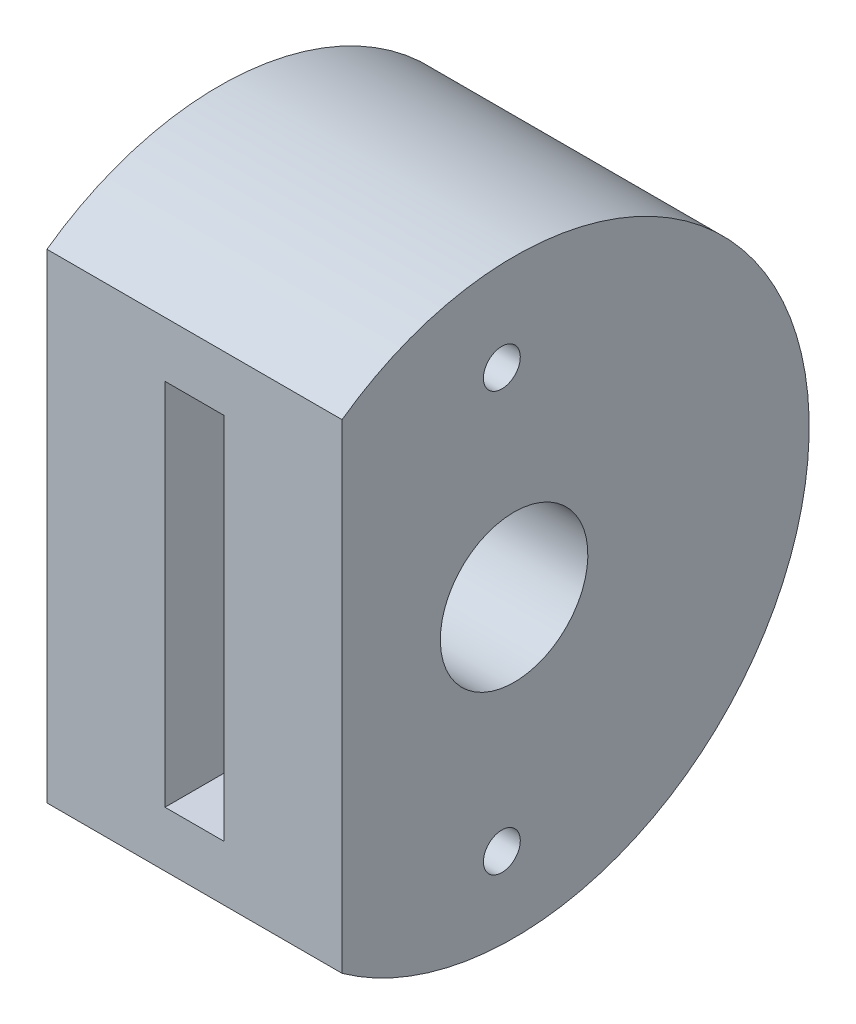
ISO-10303-21;
HEADER;
FILE_DESCRIPTION(('STEP AP214'),'2;1');
FILE_NAME('part.step','',(''),(''),'','','');
FILE_SCHEMA(('AUTOMOTIVE_DESIGN { 1 0 10303 214 1 1 1 1 }'));
ENDSEC;
DATA;
#1=APPLICATION_CONTEXT('core data for automotive mechanical design processes');
#2=APPLICATION_PROTOCOL_DEFINITION('international standard','automotive_design',2000,#1);
#3=PRODUCT_CONTEXT('',#1,'mechanical');
#4=PRODUCT('Part','Part','',(#3));
#5=PRODUCT_RELATED_PRODUCT_CATEGORY('part','',(#4));
#6=PRODUCT_DEFINITION_FORMATION('','',#4);
#7=PRODUCT_DEFINITION_CONTEXT('part definition',#1,'design');
#8=PRODUCT_DEFINITION('design','',#6,#7);
#9=PRODUCT_DEFINITION_SHAPE('','',#8);
#10=(LENGTH_UNIT() NAMED_UNIT(*) SI_UNIT(.MILLI.,.METRE.));
#11=(NAMED_UNIT(*) PLANE_ANGLE_UNIT() SI_UNIT($,.RADIAN.));
#12=(NAMED_UNIT(*) SI_UNIT($,.STERADIAN.) SOLID_ANGLE_UNIT());
#13=UNCERTAINTY_MEASURE_WITH_UNIT(LENGTH_MEASURE(1.E-05),#10,'distance_accuracy_value','');
#14=(GEOMETRIC_REPRESENTATION_CONTEXT(3) GLOBAL_UNCERTAINTY_ASSIGNED_CONTEXT((#13)) GLOBAL_UNIT_ASSIGNED_CONTEXT((#10,
#11,#12)) REPRESENTATION_CONTEXT('',''));
#15=CARTESIAN_POINT('',(0.,0.,0.));
#16=DIRECTION('',(0.,0.,1.));
#17=DIRECTION('',(1.,0.,0.));
#18=AXIS2_PLACEMENT_3D('',#15,#16,#17);
#19=CARTESIAN_POINT('',(-25.0457221896275,-2.04840081594534,4.83009691971683));
#20=DIRECTION('',(0.,0.,1.));
#21=DIRECTION('',(1.,0.,0.));
#22=AXIS2_PLACEMENT_3D('',#19,#20,#21);
#23=PLANE('',#22);
#24=DIRECTION('',(0.,1.,0.));
#25=VECTOR('',#24,1.);
#26=CARTESIAN_POINT('',(-13.0457221896275,-30.7984008159453,4.83009691971683));
#27=LINE('',#26,#25);
#28=CARTESIAN_POINT('',(-13.0457221896275,-28.0484008159453,4.83009691971683));
#29=VERTEX_POINT('',#28);
#30=CARTESIAN_POINT('',(-13.0457221896275,-8.54840081594534,4.83009691971683));
#31=VERTEX_POINT('',#30);
#32=EDGE_CURVE('E149',#29,#31,#27,.T.);
#33=ORIENTED_EDGE('',*,*,#32,.T.);
#34=DIRECTION('',(-1.,0.,0.));
#35=VECTOR('',#34,1.);
#36=CARTESIAN_POINT('',(-25.0457221896275,-8.54840081594534,4.83009691971683));
#37=LINE('',#36,#35);
#38=CARTESIAN_POINT('',(-17.0457221896275,-8.54840081594534,4.83009691971683));
#39=VERTEX_POINT('',#38);
#40=EDGE_CURVE('E137',#31,#39,#37,.T.);
#41=ORIENTED_EDGE('',*,*,#40,.T.);
#42=DIRECTION('',(0.,-1.,0.));
#43=VECTOR('',#42,1.);
#44=CARTESIAN_POINT('',(-17.0457221896275,-30.7984008159453,4.83009691971683));
#45=LINE('',#44,#43);
#46=CARTESIAN_POINT('',(-17.0457221896275,-28.0484008159453,4.83009691971683));
#47=VERTEX_POINT('',#46);
#48=EDGE_CURVE('E157',#39,#47,#45,.T.);
#49=ORIENTED_EDGE('',*,*,#48,.T.);
#50=DIRECTION('',(1.,0.,0.));
#51=VECTOR('',#50,1.);
#52=CARTESIAN_POINT('',(-25.0457221896275,-28.0484008159453,4.83009691971683));
#53=LINE('',#52,#51);
#54=EDGE_CURVE('E122',#47,#29,#53,.T.);
#55=ORIENTED_EDGE('',*,*,#54,.T.);
#56=EDGE_LOOP('',(#33,#41,#49,#55));
#57=FACE_BOUND('',#56,.T.);
#58=ADVANCED_FACE('F38',(#57),#23,.T.);
#59=CARTESIAN_POINT('',(-25.0457221896275,-26.1084008159453,24.8300969197168));
#60=DIRECTION('',(1.,0.,0.));
#61=DIRECTION('',(0.,1.,0.));
#62=AXIS2_PLACEMENT_3D('',#59,#60,#61);
#63=PLANE('',#62);
#64=CARTESIAN_POINT('',(-25.0457221896275,-4.40679880302691,14.0003705584043));
#65=DIRECTION('',(-1.,0.,0.));
#66=DIRECTION('',(0.,-1.,0.));
#67=AXIS2_PLACEMENT_3D('',#64,#65,#66);
#68=CIRCLE('',#67,1.25);
#69=CARTESIAN_POINT('',(-25.0457221896275,-5.65679880302691,14.0003705584043));
#70=VERTEX_POINT('',#69);
#71=EDGE_CURVE('E249',#70,#70,#68,.T.);
#72=ORIENTED_EDGE('',*,*,#71,.F.);
#73=EDGE_LOOP('',(#72));
#74=FACE_BOUND('',#73,.T.);
#75=CARTESIAN_POINT('',(-25.0457221896275,-32.7962847329292,14.0003705584043));
#76=DIRECTION('',(-1.,0.,0.));
#77=DIRECTION('',(0.,-1.,0.));
#78=AXIS2_PLACEMENT_3D('',#75,#76,#77);
#79=CIRCLE('',#78,1.25);
#80=CARTESIAN_POINT('',(-25.0457221896275,-34.0462847329292,14.0003705584043));
#81=VERTEX_POINT('',#80);
#82=EDGE_CURVE('E245',#81,#81,#79,.T.);
#83=ORIENTED_EDGE('',*,*,#82,.F.);
#84=EDGE_LOOP('',(#83));
#85=FACE_BOUND('',#84,.T.);
#86=CARTESIAN_POINT('',(-25.0457221896275,-18.2984008159453,13.1708731033556));
#87=DIRECTION('',(1.,0.,0.));
#88=DIRECTION('',(0.,1.,0.));
#89=AXIS2_PLACEMENT_3D('',#86,#87,#88);
#90=CIRCLE('',#89,5.);
#91=CARTESIAN_POINT('',(-25.0457221896275,-13.2984008159453,13.1708731033556));
#92=VERTEX_POINT('',#91);
#93=EDGE_CURVE('E241',#92,#92,#90,.F.);
#94=ORIENTED_EDGE('',*,*,#93,.F.);
#95=EDGE_LOOP('',(#94));
#96=FACE_BOUND('',#95,.T.);
#97=DIRECTION('',(0.,-1.,0.));
#98=VECTOR('',#97,1.);
#99=CARTESIAN_POINT('',(-25.0457221896275,-8.32090081594534,24.8300969197168));
#100=LINE('',#99,#98);
#101=CARTESIAN_POINT('',(-25.0457221896275,-2.04840081594535,24.8300969197168));
#102=VERTEX_POINT('',#101);
#103=CARTESIAN_POINT('',(-25.0457221896274,-34.5484008159453,24.8300969197168));
#104=VERTEX_POINT('',#103);
#105=EDGE_CURVE('E119',#102,#104,#100,.T.);
#106=ORIENTED_EDGE('',*,*,#105,.F.);
#107=CARTESIAN_POINT('',(-25.0457221896275,-18.2984008159453,13.1708731033558));
#108=DIRECTION('',(1.,0.,0.));
#109=DIRECTION('',(0.,-1.,0.));
#110=AXIS2_PLACEMENT_3D('',#107,#108,#109);
#111=CIRCLE('',#110,20.);
#112=EDGE_CURVE('E103',#104,#102,#111,.T.);
#113=ORIENTED_EDGE('',*,*,#112,.F.);
#114=EDGE_LOOP('',(#106,#113));
#115=FACE_BOUND('',#114,.T.);
#116=ADVANCED_FACE('F124',(#74,#85,#96,#115),#63,.F.);
#117=CARTESIAN_POINT('',(-5.04572218962746,-2.04840081594534,24.8300969197168));
#118=DIRECTION('',(-1.,0.,0.));
#119=DIRECTION('',(0.,-1.,0.));
#120=AXIS2_PLACEMENT_3D('',#117,#118,#119);
#121=PLANE('',#120);
#122=CARTESIAN_POINT('',(-5.04572218962746,-4.40679880302691,14.0003705584043));
#123=DIRECTION('',(-1.,0.,0.));
#124=DIRECTION('',(0.,-1.,0.));
#125=AXIS2_PLACEMENT_3D('',#122,#123,#124);
#126=CIRCLE('',#125,1.25);
#127=CARTESIAN_POINT('',(-5.04572218962746,-5.65679880302691,14.0003705584043));
#128=VERTEX_POINT('',#127);
#129=EDGE_CURVE('E227',#128,#128,#126,.T.);
#130=ORIENTED_EDGE('',*,*,#129,.T.);
#131=EDGE_LOOP('',(#130));
#132=FACE_BOUND('',#131,.T.);
#133=CARTESIAN_POINT('',(-5.04572218962745,-32.7962847329292,14.0003705584043));
#134=DIRECTION('',(-1.,0.,0.));
#135=DIRECTION('',(0.,-1.,0.));
#136=AXIS2_PLACEMENT_3D('',#133,#134,#135);
#137=CIRCLE('',#136,1.25);
#138=CARTESIAN_POINT('',(-5.04572218962745,-34.0462847329292,14.0003705584043));
#139=VERTEX_POINT('',#138);
#140=EDGE_CURVE('E231',#139,#139,#137,.T.);
#141=ORIENTED_EDGE('',*,*,#140,.T.);
#142=EDGE_LOOP('',(#141));
#143=FACE_BOUND('',#142,.T.);
#144=CARTESIAN_POINT('',(-5.04572218962745,-18.2984008159453,13.1708731033556));
#145=DIRECTION('',(1.,0.,0.));
#146=DIRECTION('',(0.,1.,0.));
#147=AXIS2_PLACEMENT_3D('',#144,#145,#146);
#148=CIRCLE('',#147,5.);
#149=CARTESIAN_POINT('',(-5.04572218962745,-13.2984008159453,13.1708731033556));
#150=VERTEX_POINT('',#149);
#151=EDGE_CURVE('E235',#150,#150,#148,.T.);
#152=ORIENTED_EDGE('',*,*,#151,.F.);
#153=EDGE_LOOP('',(#152));
#154=FACE_BOUND('',#153,.T.);
#155=DIRECTION('',(0.,1.,0.));
#156=VECTOR('',#155,1.);
#157=CARTESIAN_POINT('',(-5.04572218962746,-34.5484008159453,24.8300969197168));
#158=LINE('',#157,#156);
#159=CARTESIAN_POINT('',(-5.04572218962745,-34.5484008159453,24.8300969197168));
#160=VERTEX_POINT('',#159);
#161=CARTESIAN_POINT('',(-5.04572218962746,-2.04840081594534,24.8300969197168));
#162=VERTEX_POINT('',#161);
#163=EDGE_CURVE('E121',#160,#162,#158,.T.);
#164=ORIENTED_EDGE('',*,*,#163,.F.);
#165=CARTESIAN_POINT('',(-5.04572218962745,-18.2984008159453,13.1708731033558));
#166=DIRECTION('',(1.,0.,0.));
#167=DIRECTION('',(0.,-1.,0.));
#168=AXIS2_PLACEMENT_3D('',#165,#166,#167);
#169=CIRCLE('',#168,20.);
#170=EDGE_CURVE('E114',#160,#162,#169,.T.);
#171=ORIENTED_EDGE('',*,*,#170,.T.);
#172=EDGE_LOOP('',(#164,#171));
#173=FACE_BOUND('',#172,.T.);
#174=ADVANCED_FACE('F201',(#132,#143,#154,#173),#121,.F.);
#175=CARTESIAN_POINT('',(-11.2842916422206,-13.7213059329954,24.8300969197168));
#176=DIRECTION('',(0.,0.,-1.));
#177=DIRECTION('',(-1.,0.,0.));
#178=AXIS2_PLACEMENT_3D('',#175,#176,#177);
#179=PLANE('',#178);
#180=DIRECTION('',(1.,0.,0.));
#181=VECTOR('',#180,1.);
#182=CARTESIAN_POINT('',(-13.0457221896275,-30.7984008159453,24.8300969197168));
#183=LINE('',#182,#181);
#184=CARTESIAN_POINT('',(-17.0457221896275,-30.7984008159453,24.8300969197168));
#185=VERTEX_POINT('',#184);
#186=CARTESIAN_POINT('',(-13.0457221896275,-30.7984008159453,24.8300969197168));
#187=VERTEX_POINT('',#186);
#188=EDGE_CURVE('E174',#185,#187,#183,.T.);
#189=ORIENTED_EDGE('',*,*,#188,.F.);
#190=DIRECTION('',(0.,-1.,0.));
#191=VECTOR('',#190,1.);
#192=CARTESIAN_POINT('',(-17.0457221896275,-30.7984008159453,24.8300969197168));
#193=LINE('',#192,#191);
#194=CARTESIAN_POINT('',(-17.0457221896275,-5.79840081594534,24.8300969197168));
#195=VERTEX_POINT('',#194);
#196=EDGE_CURVE('E113',#195,#185,#193,.T.);
#197=ORIENTED_EDGE('',*,*,#196,.F.);
#198=DIRECTION('',(-1.,0.,0.));
#199=VECTOR('',#198,1.);
#200=CARTESIAN_POINT('',(-13.0457221896275,-5.79840081594534,24.8300969197168));
#201=LINE('',#200,#199);
#202=CARTESIAN_POINT('',(-13.0457221896275,-5.79840081594534,24.8300969197168));
#203=VERTEX_POINT('',#202);
#204=EDGE_CURVE('E166',#203,#195,#201,.T.);
#205=ORIENTED_EDGE('',*,*,#204,.F.);
#206=DIRECTION('',(0.,1.,0.));
#207=VECTOR('',#206,1.);
#208=CARTESIAN_POINT('',(-13.0457221896275,-30.7984008159453,24.8300969197168));
#209=LINE('',#208,#207);
#210=EDGE_CURVE('E170',#187,#203,#209,.T.);
#211=ORIENTED_EDGE('',*,*,#210,.F.);
#212=EDGE_LOOP('',(#189,#197,#205,#211));
#213=FACE_BOUND('',#212,.T.);
#214=ORIENTED_EDGE('',*,*,#105,.T.);
#215=DIRECTION('',(1.,0.,0.));
#216=VECTOR('',#215,1.);
#217=CARTESIAN_POINT('',(-25.0457221896275,-34.5484008159453,24.8300969197168));
#218=LINE('',#217,#216);
#219=EDGE_CURVE('E109',#104,#160,#218,.T.);
#220=ORIENTED_EDGE('',*,*,#219,.T.);
#221=ORIENTED_EDGE('',*,*,#163,.T.);
#222=DIRECTION('',(-1.,0.,0.));
#223=VECTOR('',#222,1.);
#224=CARTESIAN_POINT('',(-25.0457221896275,-2.04840081594534,24.8300969197168));
#225=LINE('',#224,#223);
#226=EDGE_CURVE('E106',#162,#102,#225,.T.);
#227=ORIENTED_EDGE('',*,*,#226,.T.);
#228=EDGE_LOOP('',(#214,#220,#221,#227));
#229=FACE_BOUND('',#228,.T.);
#230=ADVANCED_FACE('F118',(#213,#229),#179,.F.);
#231=CARTESIAN_POINT('',(-17.0457221896275,-30.7984008159453,4.83009691971683));
#232=DIRECTION('',(-1.,0.,0.));
#233=DIRECTION('',(0.,0.,1.));
#234=AXIS2_PLACEMENT_3D('',#231,#232,#233);
#235=PLANE('',#234);
#236=CARTESIAN_POINT('',(-17.0457221896275,-18.2984008159453,13.1708731033556));
#237=DIRECTION('',(-1.,0.,0.));
#238=DIRECTION('',(0.,0.,1.));
#239=AXIS2_PLACEMENT_3D('',#236,#237,#238);
#240=CIRCLE('',#239,5.);
#241=CARTESIAN_POINT('',(-17.0457221896275,-18.2984008159453,18.1708731033556));
#242=VERTEX_POINT('',#241);
#243=EDGE_CURVE('E236',#242,#242,#240,.T.);
#244=ORIENTED_EDGE('',*,*,#243,.T.);
#245=EDGE_LOOP('',(#244));
#246=FACE_BOUND('',#245,.T.);
#247=ORIENTED_EDGE('',*,*,#48,.F.);
#248=CARTESIAN_POINT('',(-17.0457221896275,-8.54840081594534,7.58009691971683));
#249=DIRECTION('',(-1.,0.,0.));
#250=DIRECTION('',(0.,0.,1.));
#251=AXIS2_PLACEMENT_3D('',#248,#249,#250);
#252=CIRCLE('',#251,2.75);
#253=CARTESIAN_POINT('',(-17.0457221896275,-5.79840081594534,7.58009691971683));
#254=VERTEX_POINT('',#253);
#255=EDGE_CURVE('E142',#39,#254,#252,.F.);
#256=ORIENTED_EDGE('',*,*,#255,.T.);
#257=DIRECTION('',(0.,0.,1.));
#258=VECTOR('',#257,1.);
#259=CARTESIAN_POINT('',(-17.0457221896275,-5.79840081594534,4.83009691971683));
#260=LINE('',#259,#258);
#261=EDGE_CURVE('E125',#254,#195,#260,.T.);
#262=ORIENTED_EDGE('',*,*,#261,.T.);
#263=ORIENTED_EDGE('',*,*,#196,.T.);
#264=DIRECTION('',(0.,0.,1.));
#265=VECTOR('',#264,1.);
#266=CARTESIAN_POINT('',(-17.0457221896275,-30.7984008159453,4.83009691971683));
#267=LINE('',#266,#265);
#268=CARTESIAN_POINT('',(-17.0457221896275,-30.7984008159453,7.58009691971683));
#269=VERTEX_POINT('',#268);
#270=EDGE_CURVE('E131',#269,#185,#267,.T.);
#271=ORIENTED_EDGE('',*,*,#270,.F.);
#272=CARTESIAN_POINT('',(-17.0457221896275,-28.0484008159453,7.58009691971683));
#273=DIRECTION('',(-1.,0.,0.));
#274=DIRECTION('',(0.,0.,1.));
#275=AXIS2_PLACEMENT_3D('',#272,#273,#274);
#276=CIRCLE('',#275,2.75);
#277=EDGE_CURVE('E140',#269,#47,#276,.F.);
#278=ORIENTED_EDGE('',*,*,#277,.T.);
#279=EDGE_LOOP('',(#247,#256,#262,#263,#271,#278));
#280=FACE_BOUND('',#279,.T.);
#281=ADVANCED_FACE('F161',(#246,#280),#235,.F.);
#282=CARTESIAN_POINT('',(-13.0457221896275,-5.79840081594534,4.83009691971683));
#283=DIRECTION('',(0.,1.,0.));
#284=DIRECTION('',(0.,0.,1.));
#285=AXIS2_PLACEMENT_3D('',#282,#283,#284);
#286=PLANE('',#285);
#287=ORIENTED_EDGE('',*,*,#261,.F.);
#288=DIRECTION('',(-1.,0.,0.));
#289=VECTOR('',#288,1.);
#290=CARTESIAN_POINT('',(-13.0457221896275,-5.79840081594534,7.58009691971683));
#291=LINE('',#290,#289);
#292=CARTESIAN_POINT('',(-13.0457221896275,-5.79840081594534,7.58009691971683));
#293=VERTEX_POINT('',#292);
#294=EDGE_CURVE('E62',#254,#293,#291,.F.);
#295=ORIENTED_EDGE('',*,*,#294,.T.);
#296=DIRECTION('',(0.,0.,1.));
#297=VECTOR('',#296,1.);
#298=CARTESIAN_POINT('',(-13.0457221896275,-5.79840081594534,4.83009691971683));
#299=LINE('',#298,#297);
#300=EDGE_CURVE('E128',#293,#203,#299,.T.);
#301=ORIENTED_EDGE('',*,*,#300,.T.);
#302=ORIENTED_EDGE('',*,*,#204,.T.);
#303=EDGE_LOOP('',(#287,#295,#301,#302));
#304=FACE_BOUND('',#303,.T.);
#305=ADVANCED_FACE('F164',(#304),#286,.F.);
#306=CARTESIAN_POINT('',(-13.0457221896275,-30.7984008159453,4.83009691971683));
#307=DIRECTION('',(1.,0.,0.));
#308=DIRECTION('',(0.,0.,-1.));
#309=AXIS2_PLACEMENT_3D('',#306,#307,#308);
#310=PLANE('',#309);
#311=CARTESIAN_POINT('',(-13.0457221896275,-18.2984008159453,13.1708731033556));
#312=DIRECTION('',(1.,0.,0.));
#313=DIRECTION('',(0.,0.,-1.));
#314=AXIS2_PLACEMENT_3D('',#311,#312,#313);
#315=CIRCLE('',#314,5.);
#316=CARTESIAN_POINT('',(-13.0457221896275,-18.2984008159453,8.1708731033556));
#317=VERTEX_POINT('',#316);
#318=EDGE_CURVE('E42',#317,#317,#315,.T.);
#319=ORIENTED_EDGE('',*,*,#318,.T.);
#320=EDGE_LOOP('',(#319));
#321=FACE_BOUND('',#320,.T.);
#322=ORIENTED_EDGE('',*,*,#300,.F.);
#323=CARTESIAN_POINT('',(-13.0457221896275,-8.54840081594534,7.58009691971683));
#324=DIRECTION('',(1.,0.,0.));
#325=DIRECTION('',(0.,0.,-1.));
#326=AXIS2_PLACEMENT_3D('',#323,#324,#325);
#327=CIRCLE('',#326,2.75);
#328=EDGE_CURVE('E47',#293,#31,#327,.F.);
#329=ORIENTED_EDGE('',*,*,#328,.T.);
#330=ORIENTED_EDGE('',*,*,#32,.F.);
#331=CARTESIAN_POINT('',(-13.0457221896275,-28.0484008159453,7.58009691971683));
#332=DIRECTION('',(1.,0.,0.));
#333=DIRECTION('',(0.,0.,-1.));
#334=AXIS2_PLACEMENT_3D('',#331,#332,#333);
#335=CIRCLE('',#334,2.75);
#336=CARTESIAN_POINT('',(-13.0457221896275,-30.7984008159453,7.58009691971683));
#337=VERTEX_POINT('',#336);
#338=EDGE_CURVE('E54',#29,#337,#335,.F.);
#339=ORIENTED_EDGE('',*,*,#338,.T.);
#340=DIRECTION('',(0.,0.,1.));
#341=VECTOR('',#340,1.);
#342=CARTESIAN_POINT('',(-13.0457221896275,-30.7984008159453,4.83009691971683));
#343=LINE('',#342,#341);
#344=EDGE_CURVE('E181',#337,#187,#343,.T.);
#345=ORIENTED_EDGE('',*,*,#344,.T.);
#346=ORIENTED_EDGE('',*,*,#210,.T.);
#347=EDGE_LOOP('',(#322,#329,#330,#339,#345,#346));
#348=FACE_BOUND('',#347,.T.);
#349=ADVANCED_FACE('F148',(#321,#348),#310,.F.);
#350=CARTESIAN_POINT('',(-13.0457221896275,-30.7984008159453,4.83009691971683));
#351=DIRECTION('',(0.,-1.,0.));
#352=DIRECTION('',(0.,0.,-1.));
#353=AXIS2_PLACEMENT_3D('',#350,#351,#352);
#354=PLANE('',#353);
#355=ORIENTED_EDGE('',*,*,#344,.F.);
#356=DIRECTION('',(1.,0.,0.));
#357=VECTOR('',#356,1.);
#358=CARTESIAN_POINT('',(-13.0457221896275,-30.7984008159453,7.58009691971683));
#359=LINE('',#358,#357);
#360=EDGE_CURVE('E11',#337,#269,#359,.F.);
#361=ORIENTED_EDGE('',*,*,#360,.T.);
#362=ORIENTED_EDGE('',*,*,#270,.T.);
#363=ORIENTED_EDGE('',*,*,#188,.T.);
#364=EDGE_LOOP('',(#355,#361,#362,#363));
#365=FACE_BOUND('',#364,.T.);
#366=ADVANCED_FACE('F183',(#365),#354,.F.);
#367=CARTESIAN_POINT('',(-25.0457221896275,-18.2984008159453,13.1708731033558));
#368=DIRECTION('',(1.,0.,0.));
#369=DIRECTION('',(0.,1.,0.));
#370=AXIS2_PLACEMENT_3D('',#367,#368,#369);
#371=CYLINDRICAL_SURFACE('',#370,20.);
#372=ORIENTED_EDGE('',*,*,#170,.F.);
#373=ORIENTED_EDGE('',*,*,#219,.F.);
#374=ORIENTED_EDGE('',*,*,#112,.T.);
#375=ORIENTED_EDGE('',*,*,#226,.F.);
#376=EDGE_LOOP('',(#372,#373,#374,#375));
#377=FACE_BOUND('',#376,.T.);
#378=ADVANCED_FACE('F105',(#377),#371,.T.);
#379=CARTESIAN_POINT('',(-25.0457221896275,-8.54840081594534,7.58009691971683));
#380=DIRECTION('',(-1.,0.,0.));
#381=DIRECTION('',(0.,0.,1.));
#382=AXIS2_PLACEMENT_3D('',#379,#380,#381);
#383=CYLINDRICAL_SURFACE('',#382,2.75);
#384=ORIENTED_EDGE('',*,*,#328,.F.);
#385=ORIENTED_EDGE('',*,*,#294,.F.);
#386=ORIENTED_EDGE('',*,*,#255,.F.);
#387=ORIENTED_EDGE('',*,*,#40,.F.);
#388=EDGE_LOOP('',(#384,#385,#386,#387));
#389=FACE_BOUND('',#388,.T.);
#390=ADVANCED_FACE('F159',(#389),#383,.F.);
#391=CARTESIAN_POINT('',(-25.0457221896275,-28.0484008159453,7.58009691971683));
#392=DIRECTION('',(1.,0.,0.));
#393=DIRECTION('',(0.,0.,-1.));
#394=AXIS2_PLACEMENT_3D('',#391,#392,#393);
#395=CYLINDRICAL_SURFACE('',#394,2.75);
#396=ORIENTED_EDGE('',*,*,#277,.F.);
#397=ORIENTED_EDGE('',*,*,#360,.F.);
#398=ORIENTED_EDGE('',*,*,#338,.F.);
#399=ORIENTED_EDGE('',*,*,#54,.F.);
#400=EDGE_LOOP('',(#396,#397,#398,#399));
#401=FACE_BOUND('',#400,.T.);
#402=ADVANCED_FACE('F40',(#401),#395,.F.);
#403=CARTESIAN_POINT('',(-39.1878578133584,-18.2984008159453,13.1708731033556));
#404=DIRECTION('',(1.,0.,0.));
#405=DIRECTION('',(0.,1.,0.));
#406=AXIS2_PLACEMENT_3D('',#403,#404,#405);
#407=CYLINDRICAL_SURFACE('',#406,5.);
#408=ORIENTED_EDGE('',*,*,#151,.T.);
#409=EDGE_LOOP('',(#408));
#410=FACE_BOUND('',#409,.T.);
#411=ORIENTED_EDGE('',*,*,#318,.F.);
#412=EDGE_LOOP('',(#411));
#413=FACE_BOUND('',#412,.T.);
#414=ADVANCED_FACE('F188',(#410,#413),#407,.F.);
#415=ORIENTED_EDGE('',*,*,#93,.T.);
#416=EDGE_LOOP('',(#415));
#417=FACE_BOUND('',#416,.T.);
#418=ORIENTED_EDGE('',*,*,#243,.F.);
#419=EDGE_LOOP('',(#418));
#420=FACE_BOUND('',#419,.T.);
#421=ADVANCED_FACE('F193',(#417,#420),#407,.F.);
#422=CARTESIAN_POINT('',(-5.04572218962745,-32.7962847329292,14.0003705584043));
#423=DIRECTION('',(-1.,0.,0.));
#424=DIRECTION('',(0.,-1.,0.));
#425=AXIS2_PLACEMENT_3D('',#422,#423,#424);
#426=CYLINDRICAL_SURFACE('',#425,1.25);
#427=ORIENTED_EDGE('',*,*,#140,.F.);
#428=EDGE_LOOP('',(#427));
#429=FACE_BOUND('',#428,.T.);
#430=ORIENTED_EDGE('',*,*,#82,.T.);
#431=EDGE_LOOP('',(#430));
#432=FACE_BOUND('',#431,.T.);
#433=ADVANCED_FACE('F262',(#429,#432),#426,.F.);
#434=CARTESIAN_POINT('',(-5.04572218962746,-4.40679880302691,14.0003705584043));
#435=DIRECTION('',(-1.,0.,0.));
#436=DIRECTION('',(0.,-1.,0.));
#437=AXIS2_PLACEMENT_3D('',#434,#435,#436);
#438=CYLINDRICAL_SURFACE('',#437,1.25);
#439=ORIENTED_EDGE('',*,*,#129,.F.);
#440=EDGE_LOOP('',(#439));
#441=FACE_BOUND('',#440,.T.);
#442=ORIENTED_EDGE('',*,*,#71,.T.);
#443=EDGE_LOOP('',(#442));
#444=FACE_BOUND('',#443,.T.);
#445=ADVANCED_FACE('F254',(#441,#444),#438,.F.);
#446=CLOSED_SHELL('',(#58,#116,#174,#230,#281,#305,#349,#366,#378,#390,#402,#414,#421,#433,#445));
#447=MANIFOLD_SOLID_BREP('B2',#446);
#448=ADVANCED_BREP_SHAPE_REPRESENTATION('',(#18,#447),#14);
#449=SHAPE_DEFINITION_REPRESENTATION(#9,#448);
ENDSEC;
END-ISO-10303-21;
